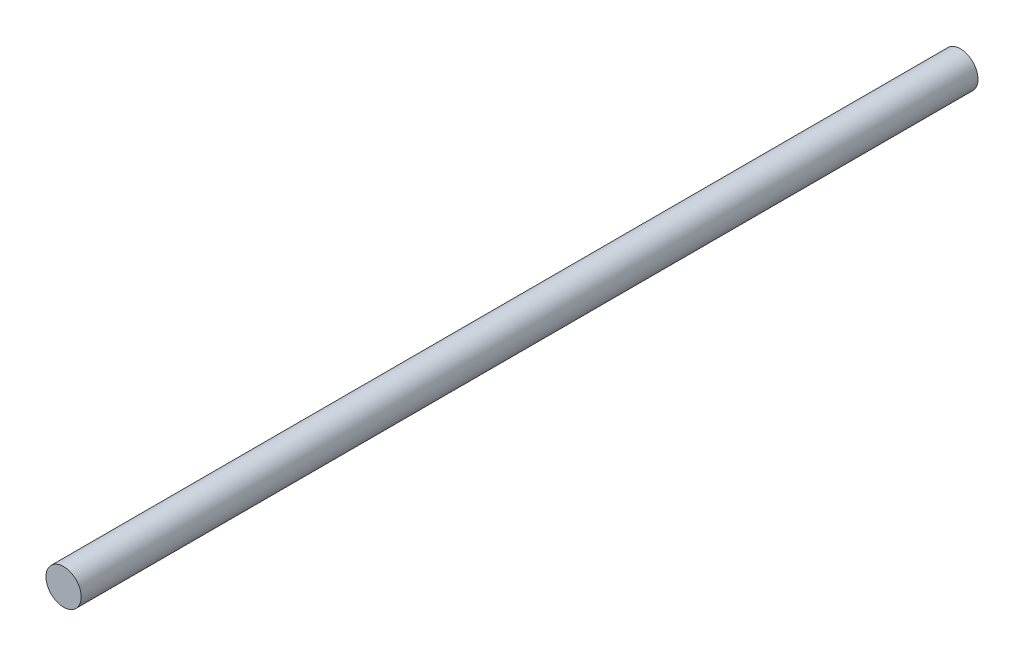
ISO-10303-21;
HEADER;
FILE_DESCRIPTION(('STEP AP214'),'2;1');
FILE_NAME('part.step','',(''),(''),'','','');
FILE_SCHEMA(('AUTOMOTIVE_DESIGN { 1 0 10303 214 1 1 1 1 }'));
ENDSEC;
DATA;
#1=APPLICATION_CONTEXT('core data for automotive mechanical design processes');
#2=APPLICATION_PROTOCOL_DEFINITION('international standard','automotive_design',2000,#1);
#3=PRODUCT_CONTEXT('',#1,'mechanical');
#4=PRODUCT('Part','Part','',(#3));
#5=PRODUCT_RELATED_PRODUCT_CATEGORY('part','',(#4));
#6=PRODUCT_DEFINITION_FORMATION('','',#4);
#7=PRODUCT_DEFINITION_CONTEXT('part definition',#1,'design');
#8=PRODUCT_DEFINITION('design','',#6,#7);
#9=PRODUCT_DEFINITION_SHAPE('','',#8);
#10=(LENGTH_UNIT() NAMED_UNIT(*) SI_UNIT(.MILLI.,.METRE.));
#11=(NAMED_UNIT(*) PLANE_ANGLE_UNIT() SI_UNIT($,.RADIAN.));
#12=(NAMED_UNIT(*) SI_UNIT($,.STERADIAN.) SOLID_ANGLE_UNIT());
#13=UNCERTAINTY_MEASURE_WITH_UNIT(LENGTH_MEASURE(1.E-05),#10,'distance_accuracy_value','');
#14=(GEOMETRIC_REPRESENTATION_CONTEXT(3) GLOBAL_UNCERTAINTY_ASSIGNED_CONTEXT((#13)) GLOBAL_UNIT_ASSIGNED_CONTEXT((#10,
#11,#12)) REPRESENTATION_CONTEXT('',''));
#15=CARTESIAN_POINT('',(0.,0.,0.));
#16=DIRECTION('',(0.,0.,1.));
#17=DIRECTION('',(1.,0.,0.));
#18=AXIS2_PLACEMENT_3D('',#15,#16,#17);
#19=CARTESIAN_POINT('',(0.,0.,140.));
#20=DIRECTION('',(0.,0.,-1.));
#21=DIRECTION('',(-1.,0.,0.));
#22=AXIS2_PLACEMENT_3D('',#19,#20,#21);
#23=CYLINDRICAL_SURFACE('',#22,2.75);
#24=CARTESIAN_POINT('',(0.,0.,140.));
#25=DIRECTION('',(0.,0.,1.));
#26=DIRECTION('',(1.,0.,0.));
#27=AXIS2_PLACEMENT_3D('',#24,#25,#26);
#28=CIRCLE('',#27,2.75);
#29=CARTESIAN_POINT('',(2.75,0.,140.));
#30=VERTEX_POINT('',#29);
#31=EDGE_CURVE('E10',#30,#30,#28,.T.);
#32=ORIENTED_EDGE('',*,*,#31,.F.);
#33=EDGE_LOOP('',(#32));
#34=FACE_BOUND('',#33,.T.);
#35=CARTESIAN_POINT('',(0.,0.,0.));
#36=DIRECTION('',(0.,0.,1.));
#37=DIRECTION('',(1.,0.,0.));
#38=AXIS2_PLACEMENT_3D('',#35,#36,#37);
#39=CIRCLE('',#38,2.75);
#40=CARTESIAN_POINT('',(2.75,0.,0.));
#41=VERTEX_POINT('',#40);
#42=EDGE_CURVE('E34',#41,#41,#39,.T.);
#43=ORIENTED_EDGE('',*,*,#42,.T.);
#44=EDGE_LOOP('',(#43));
#45=FACE_BOUND('',#44,.T.);
#46=ADVANCED_FACE('F31',(#34,#45),#23,.T.);
#47=CARTESIAN_POINT('',(0.,0.,140.));
#48=DIRECTION('',(0.,0.,1.));
#49=DIRECTION('',(1.,0.,0.));
#50=AXIS2_PLACEMENT_3D('',#47,#48,#49);
#51=PLANE('',#50);
#52=ORIENTED_EDGE('',*,*,#31,.T.);
#53=EDGE_LOOP('',(#52));
#54=FACE_BOUND('',#53,.T.);
#55=ADVANCED_FACE('F46',(#54),#51,.T.);
#56=CARTESIAN_POINT('',(0.,0.,0.));
#57=DIRECTION('',(0.,0.,1.));
#58=DIRECTION('',(1.,0.,0.));
#59=AXIS2_PLACEMENT_3D('',#56,#57,#58);
#60=PLANE('',#59);
#61=ORIENTED_EDGE('',*,*,#42,.F.);
#62=EDGE_LOOP('',(#61));
#63=FACE_BOUND('',#62,.T.);
#64=ADVANCED_FACE('F44',(#63),#60,.F.);
#65=CLOSED_SHELL('',(#46,#55,#64));
#66=MANIFOLD_SOLID_BREP('B2',#65);
#67=ADVANCED_BREP_SHAPE_REPRESENTATION('',(#18,#66),#14);
#68=SHAPE_DEFINITION_REPRESENTATION(#9,#67);
ENDSEC;
END-ISO-10303-21;
